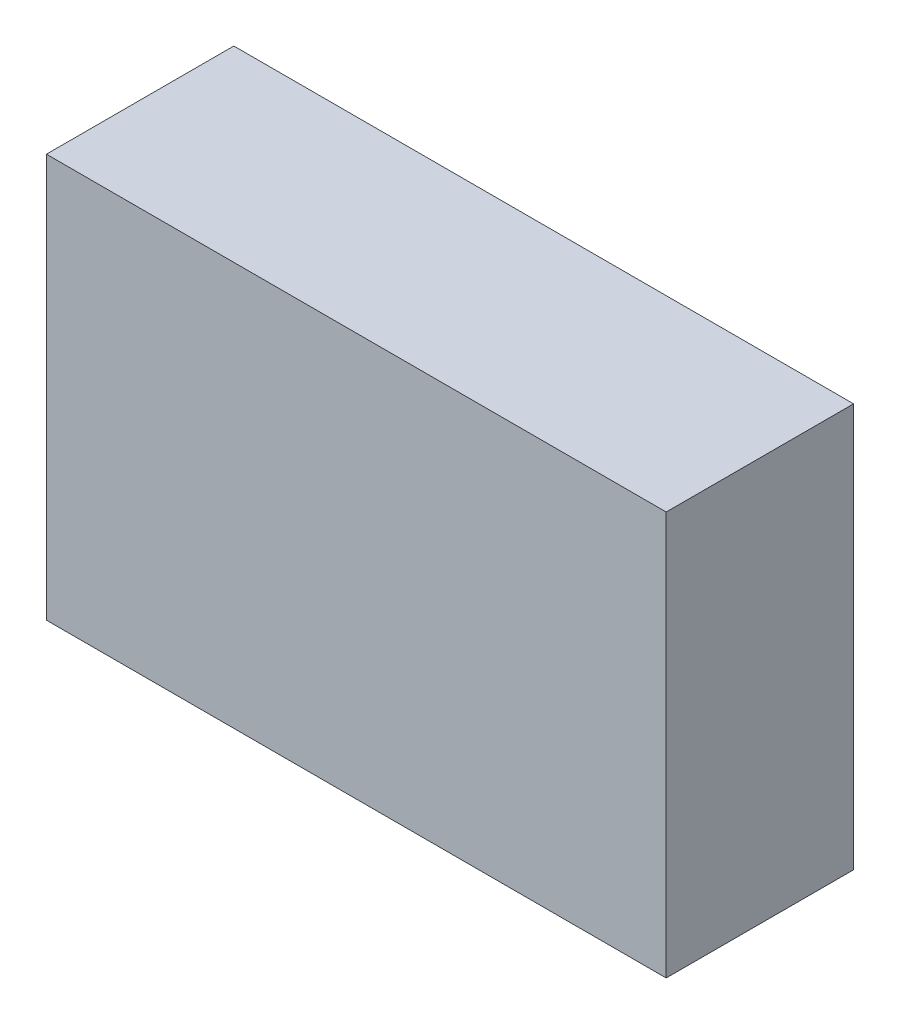
ISO-10303-21;
HEADER;
FILE_DESCRIPTION(('STEP AP214'),'2;1');
FILE_NAME('part.step','',(''),(''),'','','');
FILE_SCHEMA(('AUTOMOTIVE_DESIGN { 1 0 10303 214 1 1 1 1 }'));
ENDSEC;
DATA;
#1=APPLICATION_CONTEXT('core data for automotive mechanical design processes');
#2=APPLICATION_PROTOCOL_DEFINITION('international standard','automotive_design',2000,#1);
#3=PRODUCT_CONTEXT('',#1,'mechanical');
#4=PRODUCT('Part','Part','',(#3));
#5=PRODUCT_RELATED_PRODUCT_CATEGORY('part','',(#4));
#6=PRODUCT_DEFINITION_FORMATION('','',#4);
#7=PRODUCT_DEFINITION_CONTEXT('part definition',#1,'design');
#8=PRODUCT_DEFINITION('design','',#6,#7);
#9=PRODUCT_DEFINITION_SHAPE('','',#8);
#10=(LENGTH_UNIT() NAMED_UNIT(*) SI_UNIT(.MILLI.,.METRE.));
#11=(NAMED_UNIT(*) PLANE_ANGLE_UNIT() SI_UNIT($,.RADIAN.));
#12=(NAMED_UNIT(*) SI_UNIT($,.STERADIAN.) SOLID_ANGLE_UNIT());
#13=UNCERTAINTY_MEASURE_WITH_UNIT(LENGTH_MEASURE(1.E-05),#10,'distance_accuracy_value','');
#14=(GEOMETRIC_REPRESENTATION_CONTEXT(3) GLOBAL_UNCERTAINTY_ASSIGNED_CONTEXT((#13)) GLOBAL_UNIT_ASSIGNED_CONTEXT((#10,
#11,#12)) REPRESENTATION_CONTEXT('',''));
#15=CARTESIAN_POINT('',(0.,0.,0.));
#16=DIRECTION('',(0.,0.,1.));
#17=DIRECTION('',(1.,0.,0.));
#18=AXIS2_PLACEMENT_3D('',#15,#16,#17);
#19=CARTESIAN_POINT('',(-1.07499912,-0.70000114,0.));
#20=DIRECTION('',(0.,1.,0.));
#21=DIRECTION('',(1.,0.,0.));
#22=AXIS2_PLACEMENT_3D('',#19,#20,#21);
#23=PLANE('',#22);
#24=DIRECTION('',(1.,0.,0.));
#25=VECTOR('',#24,1.);
#26=CARTESIAN_POINT('',(-1.07499912,-0.70000114,0.));
#27=LINE('',#26,#25);
#28=CARTESIAN_POINT('',(-1.07499912,-0.70000114,0.));
#29=VERTEX_POINT('',#28);
#30=CARTESIAN_POINT('',(1.07499912,-0.70000114,0.));
#31=VERTEX_POINT('',#30);
#32=EDGE_CURVE('E9',#29,#31,#27,.T.);
#33=ORIENTED_EDGE('',*,*,#32,.T.);
#34=DIRECTION('',(0.,0.,1.));
#35=VECTOR('',#34,1.);
#36=CARTESIAN_POINT('',(1.07499912,-0.70000114,0.));
#37=LINE('',#36,#35);
#38=CARTESIAN_POINT('',(1.07499912,-0.70000114,0.65000124));
#39=VERTEX_POINT('',#38);
#40=EDGE_CURVE('E22',#31,#39,#37,.T.);
#41=ORIENTED_EDGE('',*,*,#40,.T.);
#42=DIRECTION('',(1.,0.,0.));
#43=VECTOR('',#42,1.);
#44=CARTESIAN_POINT('',(-1.07499912,-0.70000114,0.65000124));
#45=LINE('',#44,#43);
#46=CARTESIAN_POINT('',(-1.07499912,-0.70000114,0.65000124));
#47=VERTEX_POINT('',#46);
#48=EDGE_CURVE('E84',#47,#39,#45,.T.);
#49=ORIENTED_EDGE('',*,*,#48,.F.);
#50=DIRECTION('',(0.,0.,1.));
#51=VECTOR('',#50,1.);
#52=CARTESIAN_POINT('',(-1.07499912,-0.70000114,0.));
#53=LINE('',#52,#51);
#54=EDGE_CURVE('E32',#29,#47,#53,.T.);
#55=ORIENTED_EDGE('',*,*,#54,.F.);
#56=EDGE_LOOP('',(#33,#41,#49,#55));
#57=FACE_BOUND('',#56,.T.);
#58=ADVANCED_FACE('F15',(#57),#23,.F.);
#59=CARTESIAN_POINT('',(1.07499912,-0.70000114,0.));
#60=DIRECTION('',(-1.,0.,0.));
#61=DIRECTION('',(0.,1.,0.));
#62=AXIS2_PLACEMENT_3D('',#59,#60,#61);
#63=PLANE('',#62);
#64=DIRECTION('',(0.,1.,0.));
#65=VECTOR('',#64,1.);
#66=CARTESIAN_POINT('',(1.07499912,-0.70000114,0.));
#67=LINE('',#66,#65);
#68=CARTESIAN_POINT('',(1.07499912,0.70000114,0.));
#69=VERTEX_POINT('',#68);
#70=EDGE_CURVE('E81',#31,#69,#67,.T.);
#71=ORIENTED_EDGE('',*,*,#70,.T.);
#72=DIRECTION('',(0.,0.,1.));
#73=VECTOR('',#72,1.);
#74=CARTESIAN_POINT('',(1.07499912,0.70000114,0.));
#75=LINE('',#74,#73);
#76=CARTESIAN_POINT('',(1.07499912,0.70000114,0.65000124));
#77=VERTEX_POINT('',#76);
#78=EDGE_CURVE('E79',#69,#77,#75,.T.);
#79=ORIENTED_EDGE('',*,*,#78,.T.);
#80=DIRECTION('',(0.,1.,0.));
#81=VECTOR('',#80,1.);
#82=CARTESIAN_POINT('',(1.07499912,-0.70000114,0.65000124));
#83=LINE('',#82,#81);
#84=EDGE_CURVE('E58',#39,#77,#83,.T.);
#85=ORIENTED_EDGE('',*,*,#84,.F.);
#86=ORIENTED_EDGE('',*,*,#40,.F.);
#87=EDGE_LOOP('',(#71,#79,#85,#86));
#88=FACE_BOUND('',#87,.T.);
#89=ADVANCED_FACE('F87',(#88),#63,.F.);
#90=CARTESIAN_POINT('',(1.07499912,0.70000114,0.));
#91=DIRECTION('',(0.,-1.,0.));
#92=DIRECTION('',(-1.,0.,0.));
#93=AXIS2_PLACEMENT_3D('',#90,#91,#92);
#94=PLANE('',#93);
#95=DIRECTION('',(-1.,0.,0.));
#96=VECTOR('',#95,1.);
#97=CARTESIAN_POINT('',(1.07499912,0.70000114,0.));
#98=LINE('',#97,#96);
#99=CARTESIAN_POINT('',(-1.07499912,0.70000114,0.));
#100=VERTEX_POINT('',#99);
#101=EDGE_CURVE('E68',#69,#100,#98,.T.);
#102=ORIENTED_EDGE('',*,*,#101,.T.);
#103=DIRECTION('',(0.,0.,1.));
#104=VECTOR('',#103,1.);
#105=CARTESIAN_POINT('',(-1.07499912,0.70000114,0.));
#106=LINE('',#105,#104);
#107=CARTESIAN_POINT('',(-1.07499912,0.70000114,0.65000124));
#108=VERTEX_POINT('',#107);
#109=EDGE_CURVE('E62',#100,#108,#106,.T.);
#110=ORIENTED_EDGE('',*,*,#109,.T.);
#111=DIRECTION('',(-1.,0.,0.));
#112=VECTOR('',#111,1.);
#113=CARTESIAN_POINT('',(1.07499912,0.70000114,0.65000124));
#114=LINE('',#113,#112);
#115=EDGE_CURVE('E52',#77,#108,#114,.T.);
#116=ORIENTED_EDGE('',*,*,#115,.F.);
#117=ORIENTED_EDGE('',*,*,#78,.F.);
#118=EDGE_LOOP('',(#102,#110,#116,#117));
#119=FACE_BOUND('',#118,.T.);
#120=ADVANCED_FACE('F66',(#119),#94,.F.);
#121=CARTESIAN_POINT('',(-1.07499912,0.70000114,0.));
#122=DIRECTION('',(1.,0.,0.));
#123=DIRECTION('',(0.,-1.,0.));
#124=AXIS2_PLACEMENT_3D('',#121,#122,#123);
#125=PLANE('',#124);
#126=DIRECTION('',(0.,-1.,0.));
#127=VECTOR('',#126,1.);
#128=CARTESIAN_POINT('',(-1.07499912,0.70000114,0.));
#129=LINE('',#128,#127);
#130=EDGE_CURVE('E63',#100,#29,#129,.T.);
#131=ORIENTED_EDGE('',*,*,#130,.T.);
#132=ORIENTED_EDGE('',*,*,#54,.T.);
#133=DIRECTION('',(0.,-1.,0.));
#134=VECTOR('',#133,1.);
#135=CARTESIAN_POINT('',(-1.07499912,0.70000114,0.65000124));
#136=LINE('',#135,#134);
#137=EDGE_CURVE('E57',#108,#47,#136,.T.);
#138=ORIENTED_EDGE('',*,*,#137,.F.);
#139=ORIENTED_EDGE('',*,*,#109,.F.);
#140=EDGE_LOOP('',(#131,#132,#138,#139));
#141=FACE_BOUND('',#140,.T.);
#142=ADVANCED_FACE('F73',(#141),#125,.F.);
#143=CARTESIAN_POINT('',(-1.07499912,-0.70000114,0.));
#144=DIRECTION('',(0.,0.,-1.));
#145=DIRECTION('',(-1.,0.,0.));
#146=AXIS2_PLACEMENT_3D('',#143,#144,#145);
#147=PLANE('',#146);
#148=ORIENTED_EDGE('',*,*,#130,.F.);
#149=ORIENTED_EDGE('',*,*,#101,.F.);
#150=ORIENTED_EDGE('',*,*,#70,.F.);
#151=ORIENTED_EDGE('',*,*,#32,.F.);
#152=EDGE_LOOP('',(#148,#149,#150,#151));
#153=FACE_BOUND('',#152,.T.);
#154=ADVANCED_FACE('F89',(#153),#147,.T.);
#155=CARTESIAN_POINT('',(-1.07499912,-0.70000114,0.65000124));
#156=DIRECTION('',(0.,0.,-1.));
#157=DIRECTION('',(-1.,0.,0.));
#158=AXIS2_PLACEMENT_3D('',#155,#156,#157);
#159=PLANE('',#158);
#160=ORIENTED_EDGE('',*,*,#48,.T.);
#161=ORIENTED_EDGE('',*,*,#84,.T.);
#162=ORIENTED_EDGE('',*,*,#115,.T.);
#163=ORIENTED_EDGE('',*,*,#137,.T.);
#164=EDGE_LOOP('',(#160,#161,#162,#163));
#165=FACE_BOUND('',#164,.T.);
#166=ADVANCED_FACE('F55',(#165),#159,.F.);
#167=CLOSED_SHELL('',(#58,#89,#120,#142,#154,#166));
#168=MANIFOLD_SOLID_BREP('B1',#167);
#169=ADVANCED_BREP_SHAPE_REPRESENTATION('',(#18,#168),#14);
#170=SHAPE_DEFINITION_REPRESENTATION(#9,#169);
ENDSEC;
END-ISO-10303-21;
